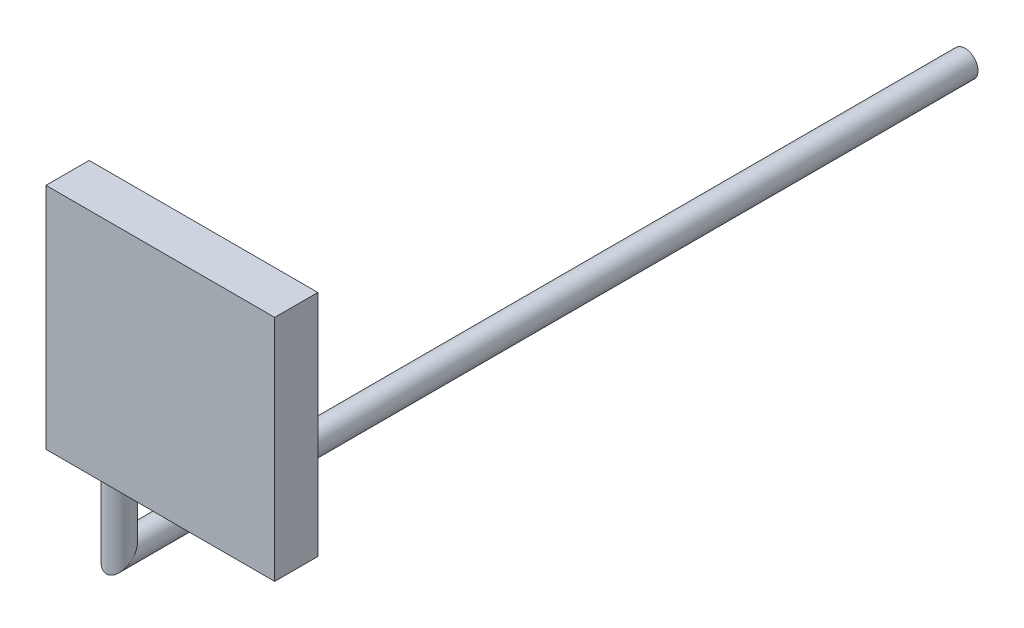
ISO-10303-21;
HEADER;
FILE_DESCRIPTION(('STEP AP214'),'2;1');
FILE_NAME('part.step','',(''),(''),'','','');
FILE_SCHEMA(('AUTOMOTIVE_DESIGN { 1 0 10303 214 1 1 1 1 }'));
ENDSEC;
DATA;
#1=APPLICATION_CONTEXT('core data for automotive mechanical design processes');
#2=APPLICATION_PROTOCOL_DEFINITION('international standard','automotive_design',2000,#1);
#3=PRODUCT_CONTEXT('',#1,'mechanical');
#4=PRODUCT('Part','Part','',(#3));
#5=PRODUCT_RELATED_PRODUCT_CATEGORY('part','',(#4));
#6=PRODUCT_DEFINITION_FORMATION('','',#4);
#7=PRODUCT_DEFINITION_CONTEXT('part definition',#1,'design');
#8=PRODUCT_DEFINITION('design','',#6,#7);
#9=PRODUCT_DEFINITION_SHAPE('','',#8);
#10=(LENGTH_UNIT() NAMED_UNIT(*) SI_UNIT(.MILLI.,.METRE.));
#11=(NAMED_UNIT(*) PLANE_ANGLE_UNIT() SI_UNIT($,.RADIAN.));
#12=(NAMED_UNIT(*) SI_UNIT($,.STERADIAN.) SOLID_ANGLE_UNIT());
#13=UNCERTAINTY_MEASURE_WITH_UNIT(LENGTH_MEASURE(1.E-05),#10,'distance_accuracy_value','');
#14=(GEOMETRIC_REPRESENTATION_CONTEXT(3) GLOBAL_UNCERTAINTY_ASSIGNED_CONTEXT((#13)) GLOBAL_UNIT_ASSIGNED_CONTEXT((#10,
#11,#12)) REPRESENTATION_CONTEXT('',''));
#15=CARTESIAN_POINT('',(0.,0.,0.));
#16=DIRECTION('',(0.,0.,1.));
#17=DIRECTION('',(1.,0.,0.));
#18=AXIS2_PLACEMENT_3D('',#15,#16,#17);
#19=CARTESIAN_POINT('',(0.,53.,10.));
#20=DIRECTION('',(1.,0.,0.));
#21=DIRECTION('',(0.,1.,0.));
#22=AXIS2_PLACEMENT_3D('',#19,#20,#21);
#23=PLANE('',#22);
#24=DIRECTION('',(0.,-1.,0.));
#25=VECTOR('',#24,1.);
#26=CARTESIAN_POINT('',(0.,53.,0.));
#27=LINE('',#26,#25);
#28=CARTESIAN_POINT('',(0.,53.,0.));
#29=VERTEX_POINT('',#28);
#30=CARTESIAN_POINT('',(0.,0.,0.));
#31=VERTEX_POINT('',#30);
#32=EDGE_CURVE('E101',#29,#31,#27,.T.);
#33=ORIENTED_EDGE('',*,*,#32,.T.);
#34=DIRECTION('',(0.,0.,-1.));
#35=VECTOR('',#34,1.);
#36=CARTESIAN_POINT('',(0.,0.,10.));
#37=LINE('',#36,#35);
#38=CARTESIAN_POINT('',(0.,0.,10.));
#39=VERTEX_POINT('',#38);
#40=EDGE_CURVE('E43',#39,#31,#37,.T.);
#41=ORIENTED_EDGE('',*,*,#40,.F.);
#42=DIRECTION('',(0.,-1.,0.));
#43=VECTOR('',#42,1.);
#44=CARTESIAN_POINT('',(0.,53.,10.));
#45=LINE('',#44,#43);
#46=CARTESIAN_POINT('',(0.,53.,10.));
#47=VERTEX_POINT('',#46);
#48=EDGE_CURVE('E87',#47,#39,#45,.T.);
#49=ORIENTED_EDGE('',*,*,#48,.F.);
#50=DIRECTION('',(0.,0.,-1.));
#51=VECTOR('',#50,1.);
#52=CARTESIAN_POINT('',(0.,53.,10.));
#53=LINE('',#52,#51);
#54=EDGE_CURVE('E97',#47,#29,#53,.T.);
#55=ORIENTED_EDGE('',*,*,#54,.T.);
#56=EDGE_LOOP('',(#33,#41,#49,#55));
#57=FACE_BOUND('',#56,.T.);
#58=ADVANCED_FACE('F35',(#57),#23,.F.);
#59=CARTESIAN_POINT('',(0.,0.,10.));
#60=DIRECTION('',(0.,1.,0.));
#61=DIRECTION('',(0.,0.,1.));
#62=AXIS2_PLACEMENT_3D('',#59,#60,#61);
#63=PLANE('',#62);
#64=CARTESIAN_POINT('',(12.,0.,5.));
#65=DIRECTION('',(0.,1.,0.));
#66=DIRECTION('',(0.,0.,1.));
#67=AXIS2_PLACEMENT_3D('',#64,#65,#66);
#68=CIRCLE('',#67,3.);
#69=CARTESIAN_POINT('',(12.,0.,8.));
#70=VERTEX_POINT('',#69);
#71=EDGE_CURVE('E11',#70,#70,#68,.F.);
#72=ORIENTED_EDGE('',*,*,#71,.F.);
#73=EDGE_LOOP('',(#72));
#74=FACE_BOUND('',#73,.T.);
#75=DIRECTION('',(1.,0.,0.));
#76=VECTOR('',#75,1.);
#77=CARTESIAN_POINT('',(0.,0.,0.));
#78=LINE('',#77,#76);
#79=CARTESIAN_POINT('',(53.,0.,0.));
#80=VERTEX_POINT('',#79);
#81=EDGE_CURVE('E92',#31,#80,#78,.T.);
#82=ORIENTED_EDGE('',*,*,#81,.T.);
#83=DIRECTION('',(0.,0.,-1.));
#84=VECTOR('',#83,1.);
#85=CARTESIAN_POINT('',(53.,0.,10.));
#86=LINE('',#85,#84);
#87=CARTESIAN_POINT('',(53.,0.,10.));
#88=VERTEX_POINT('',#87);
#89=EDGE_CURVE('E90',#88,#80,#86,.T.);
#90=ORIENTED_EDGE('',*,*,#89,.F.);
#91=DIRECTION('',(1.,0.,0.));
#92=VECTOR('',#91,1.);
#93=CARTESIAN_POINT('',(0.,0.,10.));
#94=LINE('',#93,#92);
#95=EDGE_CURVE('E82',#39,#88,#94,.T.);
#96=ORIENTED_EDGE('',*,*,#95,.F.);
#97=ORIENTED_EDGE('',*,*,#40,.T.);
#98=EDGE_LOOP('',(#82,#90,#96,#97));
#99=FACE_BOUND('',#98,.T.);
#100=ADVANCED_FACE('F91',(#74,#99),#63,.F.);
#101=CARTESIAN_POINT('',(53.,0.,10.));
#102=DIRECTION('',(-1.,0.,0.));
#103=DIRECTION('',(0.,0.,1.));
#104=AXIS2_PLACEMENT_3D('',#101,#102,#103);
#105=PLANE('',#104);
#106=DIRECTION('',(0.,1.,0.));
#107=VECTOR('',#106,1.);
#108=CARTESIAN_POINT('',(53.,0.,0.));
#109=LINE('',#108,#107);
#110=CARTESIAN_POINT('',(53.,53.,0.));
#111=VERTEX_POINT('',#110);
#112=EDGE_CURVE('E68',#80,#111,#109,.T.);
#113=ORIENTED_EDGE('',*,*,#112,.T.);
#114=DIRECTION('',(0.,0.,-1.));
#115=VECTOR('',#114,1.);
#116=CARTESIAN_POINT('',(53.,53.,10.));
#117=LINE('',#116,#115);
#118=CARTESIAN_POINT('',(53.,53.,10.));
#119=VERTEX_POINT('',#118);
#120=EDGE_CURVE('E93',#119,#111,#117,.T.);
#121=ORIENTED_EDGE('',*,*,#120,.F.);
#122=DIRECTION('',(0.,1.,0.));
#123=VECTOR('',#122,1.);
#124=CARTESIAN_POINT('',(53.,0.,10.));
#125=LINE('',#124,#123);
#126=EDGE_CURVE('E85',#88,#119,#125,.T.);
#127=ORIENTED_EDGE('',*,*,#126,.F.);
#128=ORIENTED_EDGE('',*,*,#89,.T.);
#129=EDGE_LOOP('',(#113,#121,#127,#128));
#130=FACE_BOUND('',#129,.T.);
#131=ADVANCED_FACE('F95',(#130),#105,.F.);
#132=CARTESIAN_POINT('',(53.,53.,10.));
#133=DIRECTION('',(0.,-1.,0.));
#134=DIRECTION('',(0.,0.,-1.));
#135=AXIS2_PLACEMENT_3D('',#132,#133,#134);
#136=PLANE('',#135);
#137=DIRECTION('',(-1.,0.,0.));
#138=VECTOR('',#137,1.);
#139=CARTESIAN_POINT('',(53.,53.,0.));
#140=LINE('',#139,#138);
#141=EDGE_CURVE('E74',#111,#29,#140,.T.);
#142=ORIENTED_EDGE('',*,*,#141,.T.);
#143=ORIENTED_EDGE('',*,*,#54,.F.);
#144=DIRECTION('',(-1.,0.,0.));
#145=VECTOR('',#144,1.);
#146=CARTESIAN_POINT('',(53.,53.,10.));
#147=LINE('',#146,#145);
#148=EDGE_CURVE('E51',#119,#47,#147,.T.);
#149=ORIENTED_EDGE('',*,*,#148,.F.);
#150=ORIENTED_EDGE('',*,*,#120,.T.);
#151=EDGE_LOOP('',(#142,#143,#149,#150));
#152=FACE_BOUND('',#151,.T.);
#153=ADVANCED_FACE('F124',(#152),#136,.F.);
#154=CARTESIAN_POINT('',(0.,0.,10.));
#155=DIRECTION('',(0.,0.,1.));
#156=DIRECTION('',(1.,0.,0.));
#157=AXIS2_PLACEMENT_3D('',#154,#155,#156);
#158=PLANE('',#157);
#159=ORIENTED_EDGE('',*,*,#48,.T.);
#160=ORIENTED_EDGE('',*,*,#95,.T.);
#161=ORIENTED_EDGE('',*,*,#126,.T.);
#162=ORIENTED_EDGE('',*,*,#148,.T.);
#163=EDGE_LOOP('',(#159,#160,#161,#162));
#164=FACE_BOUND('',#163,.T.);
#165=ADVANCED_FACE('F83',(#164),#158,.T.);
#166=CARTESIAN_POINT('',(0.,0.,0.));
#167=DIRECTION('',(0.,0.,1.));
#168=DIRECTION('',(1.,0.,0.));
#169=AXIS2_PLACEMENT_3D('',#166,#167,#168);
#170=PLANE('',#169);
#171=ORIENTED_EDGE('',*,*,#32,.F.);
#172=ORIENTED_EDGE('',*,*,#141,.F.);
#173=ORIENTED_EDGE('',*,*,#112,.F.);
#174=ORIENTED_EDGE('',*,*,#81,.F.);
#175=EDGE_LOOP('',(#171,#172,#173,#174));
#176=FACE_BOUND('',#175,.T.);
#177=ADVANCED_FACE('F112',(#176),#170,.F.);
#178=CARTESIAN_POINT('',(12.,-17.,-191.));
#179=DIRECTION('',(0.,0.,1.));
#180=DIRECTION('',(0.,-1.,0.));
#181=AXIS2_PLACEMENT_3D('',#178,#179,#180);
#182=PLANE('',#181);
#183=CARTESIAN_POINT('',(12.,-17.,-191.));
#184=DIRECTION('',(0.,0.,1.));
#185=DIRECTION('',(0.,-1.,0.));
#186=AXIS2_PLACEMENT_3D('',#183,#184,#185);
#187=CIRCLE('',#186,3.);
#188=CARTESIAN_POINT('',(12.,-20.,-191.));
#189=VERTEX_POINT('',#188);
#190=EDGE_CURVE('E189',#189,#189,#187,.T.);
#191=ORIENTED_EDGE('',*,*,#190,.F.);
#192=EDGE_LOOP('',(#191));
#193=FACE_BOUND('',#192,.T.);
#194=ADVANCED_FACE('F114',(#193),#182,.F.);
#195=CARTESIAN_POINT('',(12.,-17.,8.4));
#196=DIRECTION('',(0.,0.,-1.));
#197=DIRECTION('',(-1.,0.,0.));
#198=AXIS2_PLACEMENT_3D('',#195,#196,#197);
#199=CYLINDRICAL_SURFACE('',#198,3.);
#200=CARTESIAN_POINT('',(12.,-17.,5.));
#201=DIRECTION('',(0.,-0.707106781186548,-0.707106781186548));
#202=DIRECTION('',(0.,-0.707106781186548,0.707106781186548));
#203=AXIS2_PLACEMENT_3D('',#200,#201,#202);
#204=ELLIPSE('',#203,4.24264068711928,3.);
#205=CARTESIAN_POINT('',(12.,-20.,8.));
#206=VERTEX_POINT('',#205);
#207=EDGE_CURVE('E104',#206,#206,#204,.T.);
#208=ORIENTED_EDGE('',*,*,#207,.T.);
#209=EDGE_LOOP('',(#208));
#210=FACE_BOUND('',#209,.T.);
#211=ORIENTED_EDGE('',*,*,#190,.T.);
#212=EDGE_LOOP('',(#211));
#213=FACE_BOUND('',#212,.T.);
#214=ADVANCED_FACE('F121',(#210,#213),#199,.T.);
#215=CARTESIAN_POINT('',(12.,0.,5.));
#216=DIRECTION('',(0.,-1.,0.));
#217=DIRECTION('',(0.,0.,-1.));
#218=AXIS2_PLACEMENT_3D('',#215,#216,#217);
#219=CYLINDRICAL_SURFACE('',#218,3.);
#220=ORIENTED_EDGE('',*,*,#71,.T.);
#221=EDGE_LOOP('',(#220));
#222=FACE_BOUND('',#221,.T.);
#223=ORIENTED_EDGE('',*,*,#207,.F.);
#224=EDGE_LOOP('',(#223));
#225=FACE_BOUND('',#224,.T.);
#226=ADVANCED_FACE('F116',(#222,#225),#219,.T.);
#227=CLOSED_SHELL('',(#58,#100,#131,#153,#165,#177,#194,#214,#226));
#228=MANIFOLD_SOLID_BREP('B2',#227);
#229=ADVANCED_BREP_SHAPE_REPRESENTATION('',(#18,#228),#14);
#230=SHAPE_DEFINITION_REPRESENTATION(#9,#229);
ENDSEC;
END-ISO-10303-21;
